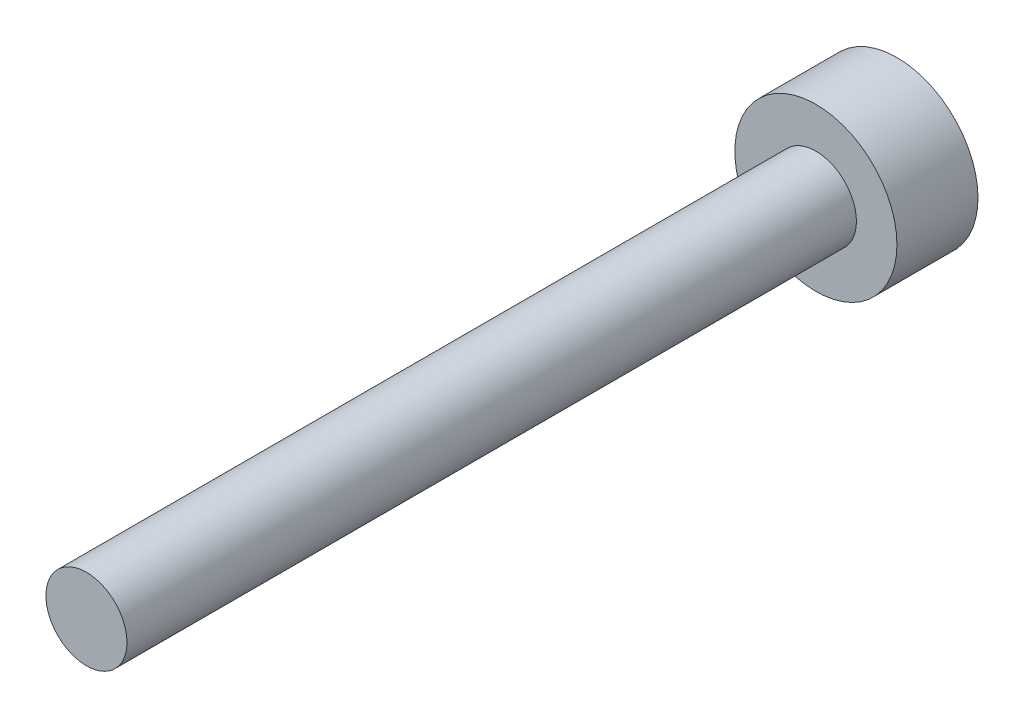
ISO-10303-21;
HEADER;
FILE_DESCRIPTION(('STEP AP214'),'2;1');
FILE_NAME('part.step','',(''),(''),'','','');
FILE_SCHEMA(('AUTOMOTIVE_DESIGN { 1 0 10303 214 1 1 1 1 }'));
ENDSEC;
DATA;
#1=APPLICATION_CONTEXT('core data for automotive mechanical design processes');
#2=APPLICATION_PROTOCOL_DEFINITION('international standard','automotive_design',2000,#1);
#3=PRODUCT_CONTEXT('',#1,'mechanical');
#4=PRODUCT('Part','Part','',(#3));
#5=PRODUCT_RELATED_PRODUCT_CATEGORY('part','',(#4));
#6=PRODUCT_DEFINITION_FORMATION('','',#4);
#7=PRODUCT_DEFINITION_CONTEXT('part definition',#1,'design');
#8=PRODUCT_DEFINITION('design','',#6,#7);
#9=PRODUCT_DEFINITION_SHAPE('','',#8);
#10=(LENGTH_UNIT() NAMED_UNIT(*) SI_UNIT(.MILLI.,.METRE.));
#11=(NAMED_UNIT(*) PLANE_ANGLE_UNIT() SI_UNIT($,.RADIAN.));
#12=(NAMED_UNIT(*) SI_UNIT($,.STERADIAN.) SOLID_ANGLE_UNIT());
#13=UNCERTAINTY_MEASURE_WITH_UNIT(LENGTH_MEASURE(1.E-05),#10,'distance_accuracy_value','');
#14=(GEOMETRIC_REPRESENTATION_CONTEXT(3) GLOBAL_UNCERTAINTY_ASSIGNED_CONTEXT((#13)) GLOBAL_UNIT_ASSIGNED_CONTEXT((#10,
#11,#12)) REPRESENTATION_CONTEXT('',''));
#15=CARTESIAN_POINT('',(0.,0.,0.));
#16=DIRECTION('',(0.,0.,1.));
#17=DIRECTION('',(1.,0.,0.));
#18=AXIS2_PLACEMENT_3D('',#15,#16,#17);
#19=CARTESIAN_POINT('',(13.1815571544014,0.,30.));
#20=DIRECTION('',(0.,0.,-1.));
#21=DIRECTION('',(-1.,0.,0.));
#22=AXIS2_PLACEMENT_3D('',#19,#20,#21);
#23=CYLINDRICAL_SURFACE('',#22,1.5);
#24=CARTESIAN_POINT('',(13.1815571544014,0.,3.));
#25=DIRECTION('',(0.,0.,1.));
#26=DIRECTION('',(1.,0.,0.));
#27=AXIS2_PLACEMENT_3D('',#24,#25,#26);
#28=CIRCLE('',#27,1.5);
#29=CARTESIAN_POINT('',(14.6815571544014,0.,3.));
#30=VERTEX_POINT('',#29);
#31=EDGE_CURVE('E39',#30,#30,#28,.T.);
#32=ORIENTED_EDGE('',*,*,#31,.T.);
#33=EDGE_LOOP('',(#32));
#34=FACE_BOUND('',#33,.T.);
#35=CARTESIAN_POINT('',(13.1815571544014,0.,30.));
#36=DIRECTION('',(0.,0.,1.));
#37=DIRECTION('',(1.,0.,0.));
#38=AXIS2_PLACEMENT_3D('',#35,#36,#37);
#39=CIRCLE('',#38,1.5);
#40=CARTESIAN_POINT('',(14.6815571544014,0.,30.));
#41=VERTEX_POINT('',#40);
#42=EDGE_CURVE('E10',#41,#41,#39,.T.);
#43=ORIENTED_EDGE('',*,*,#42,.F.);
#44=EDGE_LOOP('',(#43));
#45=FACE_BOUND('',#44,.T.);
#46=ADVANCED_FACE('F36',(#34,#45),#23,.T.);
#47=CARTESIAN_POINT('',(13.1815571544014,0.,30.));
#48=DIRECTION('',(0.,0.,1.));
#49=DIRECTION('',(1.,0.,0.));
#50=AXIS2_PLACEMENT_3D('',#47,#48,#49);
#51=PLANE('',#50);
#52=ORIENTED_EDGE('',*,*,#42,.T.);
#53=EDGE_LOOP('',(#52));
#54=FACE_BOUND('',#53,.T.);
#55=ADVANCED_FACE('F69',(#54),#51,.T.);
#56=CARTESIAN_POINT('',(13.1815571544014,0.,3.));
#57=DIRECTION('',(0.,0.,1.));
#58=DIRECTION('',(1.,0.,0.));
#59=AXIS2_PLACEMENT_3D('',#56,#57,#58);
#60=PLANE('',#59);
#61=CARTESIAN_POINT('',(13.1815571544014,0.,3.));
#62=DIRECTION('',(0.,0.,1.));
#63=DIRECTION('',(1.,0.,0.));
#64=AXIS2_PLACEMENT_3D('',#61,#62,#63);
#65=CIRCLE('',#64,3.);
#66=CARTESIAN_POINT('',(16.1815571544014,0.,3.));
#67=VERTEX_POINT('',#66);
#68=EDGE_CURVE('E46',#67,#67,#65,.T.);
#69=ORIENTED_EDGE('',*,*,#68,.T.);
#70=EDGE_LOOP('',(#69));
#71=FACE_BOUND('',#70,.T.);
#72=ORIENTED_EDGE('',*,*,#31,.F.);
#73=EDGE_LOOP('',(#72));
#74=FACE_BOUND('',#73,.T.);
#75=ADVANCED_FACE('F54',(#71,#74),#60,.T.);
#76=CARTESIAN_POINT('',(13.1815571544014,0.,3.));
#77=DIRECTION('',(0.,0.,-1.));
#78=DIRECTION('',(-1.,0.,0.));
#79=AXIS2_PLACEMENT_3D('',#76,#77,#78);
#80=CYLINDRICAL_SURFACE('',#79,3.);
#81=ORIENTED_EDGE('',*,*,#68,.F.);
#82=EDGE_LOOP('',(#81));
#83=FACE_BOUND('',#82,.T.);
#84=CARTESIAN_POINT('',(13.1815571544014,0.,0.));
#85=DIRECTION('',(0.,0.,1.));
#86=DIRECTION('',(1.,0.,0.));
#87=AXIS2_PLACEMENT_3D('',#84,#85,#86);
#88=CIRCLE('',#87,3.);
#89=CARTESIAN_POINT('',(16.1815571544014,0.,0.));
#90=VERTEX_POINT('',#89);
#91=EDGE_CURVE('E48',#90,#90,#88,.T.);
#92=ORIENTED_EDGE('',*,*,#91,.T.);
#93=EDGE_LOOP('',(#92));
#94=FACE_BOUND('',#93,.T.);
#95=ADVANCED_FACE('F57',(#83,#94),#80,.T.);
#96=CARTESIAN_POINT('',(13.1815571544014,0.,0.));
#97=DIRECTION('',(0.,0.,1.));
#98=DIRECTION('',(1.,0.,0.));
#99=AXIS2_PLACEMENT_3D('',#96,#97,#98);
#100=PLANE('',#99);
#101=ORIENTED_EDGE('',*,*,#91,.F.);
#102=EDGE_LOOP('',(#101));
#103=FACE_BOUND('',#102,.T.);
#104=ADVANCED_FACE('F60',(#103),#100,.F.);
#105=CLOSED_SHELL('',(#46,#55,#75,#95,#104));
#106=MANIFOLD_SOLID_BREP('B2',#105);
#107=ADVANCED_BREP_SHAPE_REPRESENTATION('',(#18,#106),#14);
#108=SHAPE_DEFINITION_REPRESENTATION(#9,#107);
ENDSEC;
END-ISO-10303-21;
